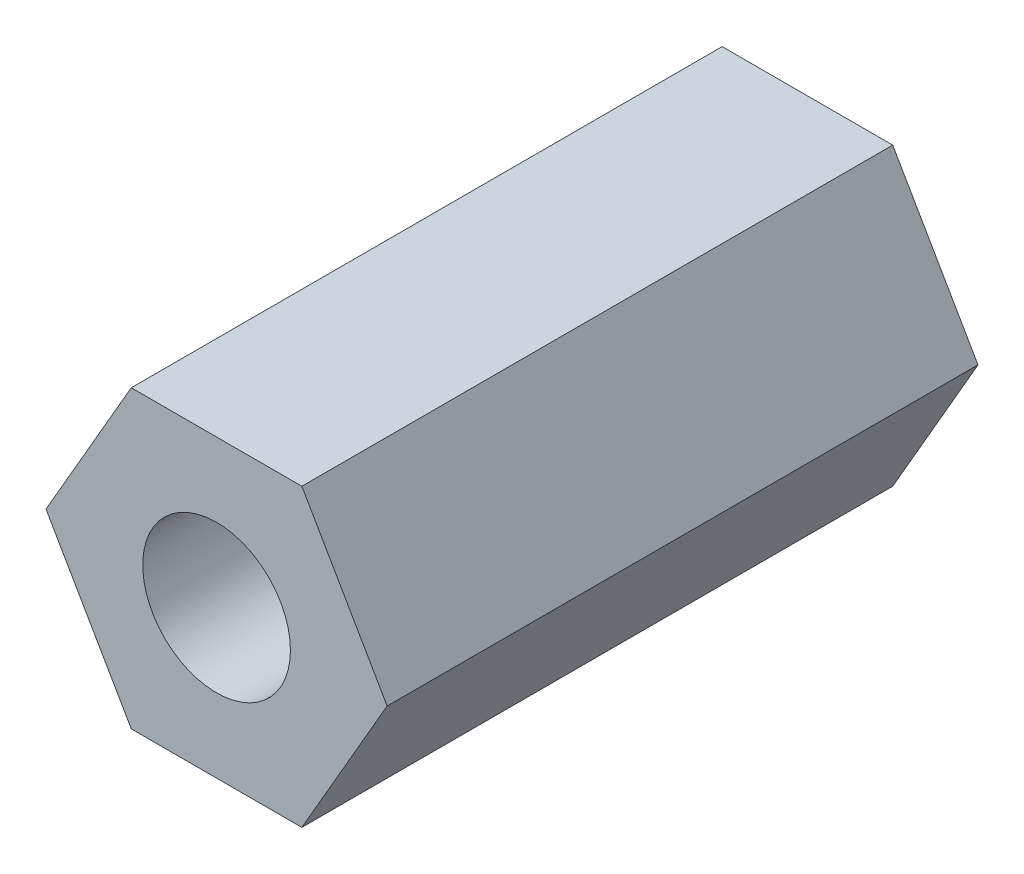
ISO-10303-21;
HEADER;
FILE_DESCRIPTION(('STEP AP214'),'2;1');
FILE_NAME('part.step','',(''),(''),'','','');
FILE_SCHEMA(('AUTOMOTIVE_DESIGN { 1 0 10303 214 1 1 1 1 }'));
ENDSEC;
DATA;
#1=APPLICATION_CONTEXT('core data for automotive mechanical design processes');
#2=APPLICATION_PROTOCOL_DEFINITION('international standard','automotive_design',2000,#1);
#3=PRODUCT_CONTEXT('',#1,'mechanical');
#4=PRODUCT('Part','Part','',(#3));
#5=PRODUCT_RELATED_PRODUCT_CATEGORY('part','',(#4));
#6=PRODUCT_DEFINITION_FORMATION('','',#4);
#7=PRODUCT_DEFINITION_CONTEXT('part definition',#1,'design');
#8=PRODUCT_DEFINITION('design','',#6,#7);
#9=PRODUCT_DEFINITION_SHAPE('','',#8);
#10=(LENGTH_UNIT() NAMED_UNIT(*) SI_UNIT(.MILLI.,.METRE.));
#11=(NAMED_UNIT(*) PLANE_ANGLE_UNIT() SI_UNIT($,.RADIAN.));
#12=(NAMED_UNIT(*) SI_UNIT($,.STERADIAN.) SOLID_ANGLE_UNIT());
#13=UNCERTAINTY_MEASURE_WITH_UNIT(LENGTH_MEASURE(1.E-05),#10,'distance_accuracy_value','');
#14=(GEOMETRIC_REPRESENTATION_CONTEXT(3) GLOBAL_UNCERTAINTY_ASSIGNED_CONTEXT((#13)) GLOBAL_UNIT_ASSIGNED_CONTEXT((#10,
#11,#12)) REPRESENTATION_CONTEXT('',''));
#15=CARTESIAN_POINT('',(0.,0.,0.));
#16=DIRECTION('',(0.,0.,1.));
#17=DIRECTION('',(1.,0.,0.));
#18=AXIS2_PLACEMENT_3D('',#15,#16,#17);
#19=CARTESIAN_POINT('',(0.,0.,25.4));
#20=DIRECTION('',(0.,0.,1.));
#21=DIRECTION('',(1.,0.,0.));
#22=AXIS2_PLACEMENT_3D('',#19,#20,#21);
#23=PLANE('',#22);
#24=DIRECTION('',(0.499999999999995,0.866025403784442,0.));
#25=VECTOR('',#24,1.);
#26=CARTESIAN_POINT('',(3.66617420935418,-6.34999999999992,25.4));
#27=LINE('',#26,#25);
#28=CARTESIAN_POINT('',(3.66617420935418,-6.34999999999992,25.4));
#29=VERTEX_POINT('',#28);
#30=CARTESIAN_POINT('',(7.33234841870821,0.,25.4));
#31=VERTEX_POINT('',#30);
#32=EDGE_CURVE('E152',#29,#31,#27,.T.);
#33=ORIENTED_EDGE('',*,*,#32,.T.);
#34=DIRECTION('',(-0.500000000000001,0.866025403784438,0.));
#35=VECTOR('',#34,1.);
#36=CARTESIAN_POINT('',(7.33234841870821,0.,25.4));
#37=LINE('',#36,#35);
#38=CARTESIAN_POINT('',(3.66617420935409,6.34999999999998,25.4));
#39=VERTEX_POINT('',#38);
#40=EDGE_CURVE('E100',#31,#39,#37,.T.);
#41=ORIENTED_EDGE('',*,*,#40,.T.);
#42=DIRECTION('',(-1.,0.,0.));
#43=VECTOR('',#42,1.);
#44=CARTESIAN_POINT('',(3.66617420935409,6.34999999999998,25.4));
#45=LINE('',#44,#43);
#46=CARTESIAN_POINT('',(-3.66617420935413,6.34999999999995,25.4));
#47=VERTEX_POINT('',#46);
#48=EDGE_CURVE('E113',#39,#47,#45,.T.);
#49=ORIENTED_EDGE('',*,*,#48,.T.);
#50=DIRECTION('',(-0.499999999999995,-0.866025403784442,0.));
#51=VECTOR('',#50,1.);
#52=CARTESIAN_POINT('',(-3.66617420935413,6.34999999999995,25.4));
#53=LINE('',#52,#51);
#54=CARTESIAN_POINT('',(-7.33234841870821,0.,25.4));
#55=VERTEX_POINT('',#54);
#56=EDGE_CURVE('E107',#47,#55,#53,.T.);
#57=ORIENTED_EDGE('',*,*,#56,.T.);
#58=DIRECTION('',(0.500000000000007,-0.866025403784435,0.));
#59=VECTOR('',#58,1.);
#60=CARTESIAN_POINT('',(-7.33234841870821,0.,25.4));
#61=LINE('',#60,#59);
#62=CARTESIAN_POINT('',(-3.66617420935405,-6.35,25.4));
#63=VERTEX_POINT('',#62);
#64=EDGE_CURVE('E111',#55,#63,#61,.T.);
#65=ORIENTED_EDGE('',*,*,#64,.T.);
#66=DIRECTION('',(1.,0.,0.));
#67=VECTOR('',#66,1.);
#68=CARTESIAN_POINT('',(-3.66617420935405,-6.35,25.4));
#69=LINE('',#68,#67);
#70=EDGE_CURVE('E63',#63,#29,#69,.T.);
#71=ORIENTED_EDGE('',*,*,#70,.T.);
#72=EDGE_LOOP('',(#33,#41,#49,#57,#65,#71));
#73=FACE_BOUND('',#72,.T.);
#74=CARTESIAN_POINT('',(0.,0.,25.4));
#75=DIRECTION('',(0.,0.,1.));
#76=DIRECTION('',(1.,0.,0.));
#77=AXIS2_PLACEMENT_3D('',#74,#75,#76);
#78=CIRCLE('',#77,3.175);
#79=CARTESIAN_POINT('',(3.175,0.,25.4));
#80=VERTEX_POINT('',#79);
#81=EDGE_CURVE('E140',#80,#80,#78,.T.);
#82=ORIENTED_EDGE('',*,*,#81,.F.);
#83=EDGE_LOOP('',(#82));
#84=FACE_BOUND('',#83,.T.);
#85=ADVANCED_FACE('F45',(#73,#84),#23,.T.);
#86=CARTESIAN_POINT('',(0.,0.,0.));
#87=DIRECTION('',(0.,0.,1.));
#88=DIRECTION('',(1.,0.,0.));
#89=AXIS2_PLACEMENT_3D('',#86,#87,#88);
#90=PLANE('',#89);
#91=DIRECTION('',(0.499999999999995,0.866025403784442,0.));
#92=VECTOR('',#91,1.);
#93=CARTESIAN_POINT('',(3.66617420935418,-6.34999999999992,0.));
#94=LINE('',#93,#92);
#95=CARTESIAN_POINT('',(3.66617420935418,-6.34999999999992,0.));
#96=VERTEX_POINT('',#95);
#97=CARTESIAN_POINT('',(7.33234841870821,0.,0.));
#98=VERTEX_POINT('',#97);
#99=EDGE_CURVE('E135',#96,#98,#94,.T.);
#100=ORIENTED_EDGE('',*,*,#99,.F.);
#101=DIRECTION('',(1.,0.,0.));
#102=VECTOR('',#101,1.);
#103=CARTESIAN_POINT('',(-3.66617420935405,-6.35,0.));
#104=LINE('',#103,#102);
#105=CARTESIAN_POINT('',(-3.66617420935405,-6.35,0.));
#106=VERTEX_POINT('',#105);
#107=EDGE_CURVE('E92',#106,#96,#104,.T.);
#108=ORIENTED_EDGE('',*,*,#107,.F.);
#109=DIRECTION('',(0.500000000000007,-0.866025403784435,0.));
#110=VECTOR('',#109,1.);
#111=CARTESIAN_POINT('',(-7.33234841870821,0.,0.));
#112=LINE('',#111,#110);
#113=CARTESIAN_POINT('',(-7.33234841870821,0.,0.));
#114=VERTEX_POINT('',#113);
#115=EDGE_CURVE('E86',#114,#106,#112,.T.);
#116=ORIENTED_EDGE('',*,*,#115,.F.);
#117=DIRECTION('',(-0.499999999999995,-0.866025403784442,0.));
#118=VECTOR('',#117,1.);
#119=CARTESIAN_POINT('',(-3.66617420935413,6.34999999999995,0.));
#120=LINE('',#119,#118);
#121=CARTESIAN_POINT('',(-3.66617420935413,6.34999999999995,0.));
#122=VERTEX_POINT('',#121);
#123=EDGE_CURVE('E122',#122,#114,#120,.T.);
#124=ORIENTED_EDGE('',*,*,#123,.F.);
#125=DIRECTION('',(-1.,0.,0.));
#126=VECTOR('',#125,1.);
#127=CARTESIAN_POINT('',(3.66617420935409,6.34999999999998,0.));
#128=LINE('',#127,#126);
#129=CARTESIAN_POINT('',(3.66617420935409,6.34999999999998,0.));
#130=VERTEX_POINT('',#129);
#131=EDGE_CURVE('E143',#130,#122,#128,.T.);
#132=ORIENTED_EDGE('',*,*,#131,.F.);
#133=DIRECTION('',(-0.500000000000001,0.866025403784438,0.));
#134=VECTOR('',#133,1.);
#135=CARTESIAN_POINT('',(7.33234841870821,0.,0.));
#136=LINE('',#135,#134);
#137=EDGE_CURVE('E139',#98,#130,#136,.T.);
#138=ORIENTED_EDGE('',*,*,#137,.F.);
#139=EDGE_LOOP('',(#100,#108,#116,#124,#132,#138));
#140=FACE_BOUND('',#139,.T.);
#141=CARTESIAN_POINT('',(0.,0.,0.));
#142=DIRECTION('',(0.,0.,1.));
#143=DIRECTION('',(1.,0.,0.));
#144=AXIS2_PLACEMENT_3D('',#141,#142,#143);
#145=CIRCLE('',#144,3.175);
#146=CARTESIAN_POINT('',(3.175,0.,0.));
#147=VERTEX_POINT('',#146);
#148=EDGE_CURVE('E249',#147,#147,#145,.T.);
#149=ORIENTED_EDGE('',*,*,#148,.T.);
#150=EDGE_LOOP('',(#149));
#151=FACE_BOUND('',#150,.T.);
#152=ADVANCED_FACE('F165',(#140,#151),#90,.F.);
#153=CARTESIAN_POINT('',(3.66617420935418,-6.34999999999992,25.4));
#154=DIRECTION('',(-0.866025403784441,0.499999999999995,0.));
#155=DIRECTION('',(-0.499999999999995,-0.866025403784442,0.));
#156=AXIS2_PLACEMENT_3D('',#153,#154,#155);
#157=PLANE('',#156);
#158=ORIENTED_EDGE('',*,*,#99,.T.);
#159=DIRECTION('',(0.,0.,-1.));
#160=VECTOR('',#159,1.);
#161=CARTESIAN_POINT('',(7.33234841870821,0.,25.4));
#162=LINE('',#161,#160);
#163=EDGE_CURVE('E11',#31,#98,#162,.T.);
#164=ORIENTED_EDGE('',*,*,#163,.F.);
#165=ORIENTED_EDGE('',*,*,#32,.F.);
#166=DIRECTION('',(0.,0.,-1.));
#167=VECTOR('',#166,1.);
#168=CARTESIAN_POINT('',(3.66617420935418,-6.34999999999992,25.4));
#169=LINE('',#168,#167);
#170=EDGE_CURVE('E131',#29,#96,#169,.T.);
#171=ORIENTED_EDGE('',*,*,#170,.T.);
#172=EDGE_LOOP('',(#158,#164,#165,#171));
#173=FACE_BOUND('',#172,.T.);
#174=ADVANCED_FACE('F47',(#173),#157,.F.);
#175=CARTESIAN_POINT('',(7.33234841870821,0.,25.4));
#176=DIRECTION('',(-0.866025403784438,-0.500000000000001,0.));
#177=DIRECTION('',(0.500000000000001,-0.866025403784438,0.));
#178=AXIS2_PLACEMENT_3D('',#175,#176,#177);
#179=PLANE('',#178);
#180=ORIENTED_EDGE('',*,*,#137,.T.);
#181=DIRECTION('',(0.,0.,-1.));
#182=VECTOR('',#181,1.);
#183=CARTESIAN_POINT('',(3.66617420935409,6.34999999999998,25.4));
#184=LINE('',#183,#182);
#185=EDGE_CURVE('E55',#39,#130,#184,.T.);
#186=ORIENTED_EDGE('',*,*,#185,.F.);
#187=ORIENTED_EDGE('',*,*,#40,.F.);
#188=ORIENTED_EDGE('',*,*,#163,.T.);
#189=EDGE_LOOP('',(#180,#186,#187,#188));
#190=FACE_BOUND('',#189,.T.);
#191=ADVANCED_FACE('F190',(#190),#179,.F.);
#192=CARTESIAN_POINT('',(3.66617420935409,6.34999999999998,25.4));
#193=DIRECTION('',(0.,-1.,0.));
#194=DIRECTION('',(1.,0.,0.));
#195=AXIS2_PLACEMENT_3D('',#192,#193,#194);
#196=PLANE('',#195);
#197=ORIENTED_EDGE('',*,*,#131,.T.);
#198=DIRECTION('',(0.,0.,-1.));
#199=VECTOR('',#198,1.);
#200=CARTESIAN_POINT('',(-3.66617420935413,6.34999999999995,25.4));
#201=LINE('',#200,#199);
#202=EDGE_CURVE('E124',#47,#122,#201,.T.);
#203=ORIENTED_EDGE('',*,*,#202,.F.);
#204=ORIENTED_EDGE('',*,*,#48,.F.);
#205=ORIENTED_EDGE('',*,*,#185,.T.);
#206=EDGE_LOOP('',(#197,#203,#204,#205));
#207=FACE_BOUND('',#206,.T.);
#208=ADVANCED_FACE('F162',(#207),#196,.F.);
#209=CARTESIAN_POINT('',(-3.66617420935413,6.34999999999995,25.4));
#210=DIRECTION('',(0.866025403784442,-0.499999999999995,0.));
#211=DIRECTION('',(0.499999999999995,0.866025403784442,0.));
#212=AXIS2_PLACEMENT_3D('',#209,#210,#211);
#213=PLANE('',#212);
#214=ORIENTED_EDGE('',*,*,#123,.T.);
#215=DIRECTION('',(0.,0.,-1.));
#216=VECTOR('',#215,1.);
#217=CARTESIAN_POINT('',(-7.33234841870821,0.,25.4));
#218=LINE('',#217,#216);
#219=EDGE_CURVE('E119',#55,#114,#218,.T.);
#220=ORIENTED_EDGE('',*,*,#219,.F.);
#221=ORIENTED_EDGE('',*,*,#56,.F.);
#222=ORIENTED_EDGE('',*,*,#202,.T.);
#223=EDGE_LOOP('',(#214,#220,#221,#222));
#224=FACE_BOUND('',#223,.T.);
#225=ADVANCED_FACE('F120',(#224),#213,.F.);
#226=CARTESIAN_POINT('',(-7.33234841870821,0.,25.4));
#227=DIRECTION('',(0.866025403784435,0.500000000000007,0.));
#228=DIRECTION('',(-0.500000000000007,0.866025403784435,0.));
#229=AXIS2_PLACEMENT_3D('',#226,#227,#228);
#230=PLANE('',#229);
#231=ORIENTED_EDGE('',*,*,#115,.T.);
#232=DIRECTION('',(0.,0.,-1.));
#233=VECTOR('',#232,1.);
#234=CARTESIAN_POINT('',(-3.66617420935405,-6.35,25.4));
#235=LINE('',#234,#233);
#236=EDGE_CURVE('E125',#63,#106,#235,.T.);
#237=ORIENTED_EDGE('',*,*,#236,.F.);
#238=ORIENTED_EDGE('',*,*,#64,.F.);
#239=ORIENTED_EDGE('',*,*,#219,.T.);
#240=EDGE_LOOP('',(#231,#237,#238,#239));
#241=FACE_BOUND('',#240,.T.);
#242=ADVANCED_FACE('F127',(#241),#230,.F.);
#243=CARTESIAN_POINT('',(-3.66617420935405,-6.35,25.4));
#244=DIRECTION('',(0.,1.,0.));
#245=DIRECTION('',(-1.,0.,0.));
#246=AXIS2_PLACEMENT_3D('',#243,#244,#245);
#247=PLANE('',#246);
#248=ORIENTED_EDGE('',*,*,#107,.T.);
#249=ORIENTED_EDGE('',*,*,#170,.F.);
#250=ORIENTED_EDGE('',*,*,#70,.F.);
#251=ORIENTED_EDGE('',*,*,#236,.T.);
#252=EDGE_LOOP('',(#248,#249,#250,#251));
#253=FACE_BOUND('',#252,.T.);
#254=ADVANCED_FACE('F170',(#253),#247,.F.);
#255=CARTESIAN_POINT('',(0.,0.,25.4));
#256=DIRECTION('',(0.,0.,-1.));
#257=DIRECTION('',(-1.,0.,0.));
#258=AXIS2_PLACEMENT_3D('',#255,#256,#257);
#259=CYLINDRICAL_SURFACE('',#258,3.175);
#260=ORIENTED_EDGE('',*,*,#81,.T.);
#261=EDGE_LOOP('',(#260));
#262=FACE_BOUND('',#261,.T.);
#263=ORIENTED_EDGE('',*,*,#148,.F.);
#264=EDGE_LOOP('',(#263));
#265=FACE_BOUND('',#264,.T.);
#266=ADVANCED_FACE('F172',(#262,#265),#259,.F.);
#267=CLOSED_SHELL('',(#85,#152,#174,#191,#208,#225,#242,#254,#266));
#268=MANIFOLD_SOLID_BREP('B2',#267);
#269=ADVANCED_BREP_SHAPE_REPRESENTATION('',(#18,#268),#14);
#270=SHAPE_DEFINITION_REPRESENTATION(#9,#269);
ENDSEC;
END-ISO-10303-21;
